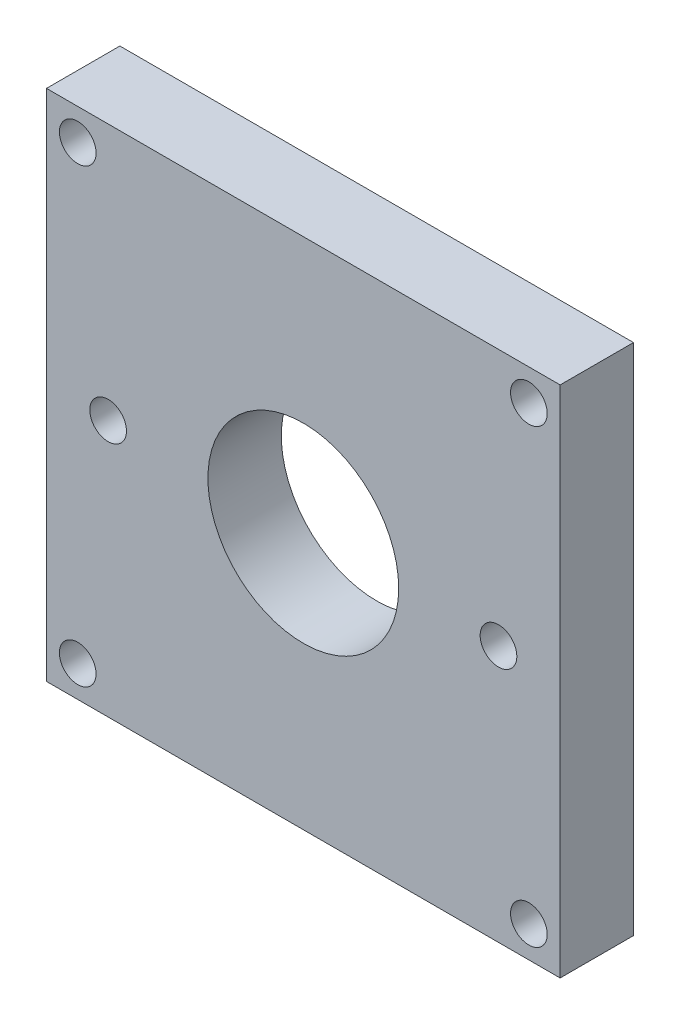
ISO-10303-21;
HEADER;
FILE_DESCRIPTION(('STEP AP214'),'2;1');
FILE_NAME('part.step','',(''),(''),'','','');
FILE_SCHEMA(('AUTOMOTIVE_DESIGN { 1 0 10303 214 1 1 1 1 }'));
ENDSEC;
DATA;
#1=APPLICATION_CONTEXT('core data for automotive mechanical design processes');
#2=APPLICATION_PROTOCOL_DEFINITION('international standard','automotive_design',2000,#1);
#3=PRODUCT_CONTEXT('',#1,'mechanical');
#4=PRODUCT('Part','Part','',(#3));
#5=PRODUCT_RELATED_PRODUCT_CATEGORY('part','',(#4));
#6=PRODUCT_DEFINITION_FORMATION('','',#4);
#7=PRODUCT_DEFINITION_CONTEXT('part definition',#1,'design');
#8=PRODUCT_DEFINITION('design','',#6,#7);
#9=PRODUCT_DEFINITION_SHAPE('','',#8);
#10=(LENGTH_UNIT() NAMED_UNIT(*) SI_UNIT(.MILLI.,.METRE.));
#11=(NAMED_UNIT(*) PLANE_ANGLE_UNIT() SI_UNIT($,.RADIAN.));
#12=(NAMED_UNIT(*) SI_UNIT($,.STERADIAN.) SOLID_ANGLE_UNIT());
#13=UNCERTAINTY_MEASURE_WITH_UNIT(LENGTH_MEASURE(1.E-05),#10,'distance_accuracy_value','');
#14=(GEOMETRIC_REPRESENTATION_CONTEXT(3) GLOBAL_UNCERTAINTY_ASSIGNED_CONTEXT((#13)) GLOBAL_UNIT_ASSIGNED_CONTEXT((#10,
#11,#12)) REPRESENTATION_CONTEXT('',''));
#15=CARTESIAN_POINT('',(0.,0.,0.));
#16=DIRECTION('',(0.,0.,1.));
#17=DIRECTION('',(1.,0.,0.));
#18=AXIS2_PLACEMENT_3D('',#15,#16,#17);
#19=CARTESIAN_POINT('',(-17.5,0.,5.));
#20=DIRECTION('',(-1.,0.,0.));
#21=DIRECTION('',(0.,0.,1.));
#22=AXIS2_PLACEMENT_3D('',#19,#20,#21);
#23=PLANE('',#22);
#24=DIRECTION('',(0.,1.,0.));
#25=VECTOR('',#24,1.);
#26=CARTESIAN_POINT('',(-17.5,0.,0.));
#27=LINE('',#26,#25);
#28=CARTESIAN_POINT('',(-17.5,-17.5,0.));
#29=VERTEX_POINT('',#28);
#30=CARTESIAN_POINT('',(-17.5,17.5,0.));
#31=VERTEX_POINT('',#30);
#32=EDGE_CURVE('E122',#29,#31,#27,.T.);
#33=ORIENTED_EDGE('',*,*,#32,.F.);
#34=DIRECTION('',(0.,0.,-1.));
#35=VECTOR('',#34,1.);
#36=CARTESIAN_POINT('',(-17.5,-17.5,5.));
#37=LINE('',#36,#35);
#38=CARTESIAN_POINT('',(-17.5,-17.5,5.));
#39=VERTEX_POINT('',#38);
#40=EDGE_CURVE('E11',#39,#29,#37,.T.);
#41=ORIENTED_EDGE('',*,*,#40,.F.);
#42=DIRECTION('',(0.,1.,0.));
#43=VECTOR('',#42,1.);
#44=CARTESIAN_POINT('',(-17.5,0.,5.));
#45=LINE('',#44,#43);
#46=CARTESIAN_POINT('',(-17.5,17.5,5.));
#47=VERTEX_POINT('',#46);
#48=EDGE_CURVE('E94',#39,#47,#45,.T.);
#49=ORIENTED_EDGE('',*,*,#48,.T.);
#50=DIRECTION('',(0.,0.,-1.));
#51=VECTOR('',#50,1.);
#52=CARTESIAN_POINT('',(-17.5,17.5,5.));
#53=LINE('',#52,#51);
#54=EDGE_CURVE('E73',#47,#31,#53,.T.);
#55=ORIENTED_EDGE('',*,*,#54,.T.);
#56=EDGE_LOOP('',(#33,#41,#49,#55));
#57=FACE_BOUND('',#56,.T.);
#58=ADVANCED_FACE('F33',(#57),#23,.T.);
#59=CARTESIAN_POINT('',(0.,-17.5,5.));
#60=DIRECTION('',(0.,-1.,0.));
#61=DIRECTION('',(0.,0.,-1.));
#62=AXIS2_PLACEMENT_3D('',#59,#60,#61);
#63=PLANE('',#62);
#64=DIRECTION('',(-1.,0.,0.));
#65=VECTOR('',#64,1.);
#66=CARTESIAN_POINT('',(0.,-17.5,0.));
#67=LINE('',#66,#65);
#68=CARTESIAN_POINT('',(17.5,-17.5,0.));
#69=VERTEX_POINT('',#68);
#70=EDGE_CURVE('E85',#69,#29,#67,.T.);
#71=ORIENTED_EDGE('',*,*,#70,.F.);
#72=DIRECTION('',(0.,0.,-1.));
#73=VECTOR('',#72,1.);
#74=CARTESIAN_POINT('',(17.5,-17.5,5.));
#75=LINE('',#74,#73);
#76=CARTESIAN_POINT('',(17.5,-17.5,5.));
#77=VERTEX_POINT('',#76);
#78=EDGE_CURVE('E42',#77,#69,#75,.T.);
#79=ORIENTED_EDGE('',*,*,#78,.F.);
#80=DIRECTION('',(-1.,0.,0.));
#81=VECTOR('',#80,1.);
#82=CARTESIAN_POINT('',(0.,-17.5,5.));
#83=LINE('',#82,#81);
#84=EDGE_CURVE('E83',#77,#39,#83,.T.);
#85=ORIENTED_EDGE('',*,*,#84,.T.);
#86=ORIENTED_EDGE('',*,*,#40,.T.);
#87=EDGE_LOOP('',(#71,#79,#85,#86));
#88=FACE_BOUND('',#87,.T.);
#89=ADVANCED_FACE('F81',(#88),#63,.T.);
#90=CARTESIAN_POINT('',(17.5,0.,5.));
#91=DIRECTION('',(-1.,0.,0.));
#92=DIRECTION('',(0.,0.,1.));
#93=AXIS2_PLACEMENT_3D('',#90,#91,#92);
#94=PLANE('',#93);
#95=DIRECTION('',(0.,1.,0.));
#96=VECTOR('',#95,1.);
#97=CARTESIAN_POINT('',(17.5,0.,0.));
#98=LINE('',#97,#96);
#99=CARTESIAN_POINT('',(17.5,17.5,0.));
#100=VERTEX_POINT('',#99);
#101=EDGE_CURVE('E125',#69,#100,#98,.T.);
#102=ORIENTED_EDGE('',*,*,#101,.T.);
#103=DIRECTION('',(0.,0.,-1.));
#104=VECTOR('',#103,1.);
#105=CARTESIAN_POINT('',(17.5,17.5,5.));
#106=LINE('',#105,#104);
#107=CARTESIAN_POINT('',(17.5,17.5,5.));
#108=VERTEX_POINT('',#107);
#109=EDGE_CURVE('E88',#108,#100,#106,.T.);
#110=ORIENTED_EDGE('',*,*,#109,.F.);
#111=DIRECTION('',(0.,1.,0.));
#112=VECTOR('',#111,1.);
#113=CARTESIAN_POINT('',(17.5,0.,5.));
#114=LINE('',#113,#112);
#115=EDGE_CURVE('E90',#77,#108,#114,.T.);
#116=ORIENTED_EDGE('',*,*,#115,.F.);
#117=ORIENTED_EDGE('',*,*,#78,.T.);
#118=EDGE_LOOP('',(#102,#110,#116,#117));
#119=FACE_BOUND('',#118,.T.);
#120=ADVANCED_FACE('F91',(#119),#94,.F.);
#121=CARTESIAN_POINT('',(-15.37,15.37,5.));
#122=DIRECTION('',(0.,0.,-1.));
#123=DIRECTION('',(-1.,0.,0.));
#124=AXIS2_PLACEMENT_3D('',#121,#122,#123);
#125=CYLINDRICAL_SURFACE('',#124,1.25);
#126=CARTESIAN_POINT('',(-15.37,15.37,5.));
#127=DIRECTION('',(0.,0.,1.));
#128=DIRECTION('',(1.,0.,0.));
#129=AXIS2_PLACEMENT_3D('',#126,#127,#128);
#130=CIRCLE('',#129,1.25);
#131=CARTESIAN_POINT('',(-14.12,15.37,5.));
#132=VERTEX_POINT('',#131);
#133=EDGE_CURVE('E96',#132,#132,#130,.T.);
#134=ORIENTED_EDGE('',*,*,#133,.T.);
#135=EDGE_LOOP('',(#134));
#136=FACE_BOUND('',#135,.T.);
#137=CARTESIAN_POINT('',(-15.37,15.37,0.));
#138=DIRECTION('',(0.,0.,1.));
#139=DIRECTION('',(1.,0.,0.));
#140=AXIS2_PLACEMENT_3D('',#137,#138,#139);
#141=CIRCLE('',#140,1.25);
#142=CARTESIAN_POINT('',(-14.12,15.37,0.));
#143=VERTEX_POINT('',#142);
#144=EDGE_CURVE('E119',#143,#143,#141,.T.);
#145=ORIENTED_EDGE('',*,*,#144,.F.);
#146=EDGE_LOOP('',(#145));
#147=FACE_BOUND('',#146,.T.);
#148=ADVANCED_FACE('F141',(#136,#147),#125,.F.);
#149=CARTESIAN_POINT('',(15.37,15.37,5.));
#150=DIRECTION('',(0.,0.,-1.));
#151=DIRECTION('',(-1.,0.,0.));
#152=AXIS2_PLACEMENT_3D('',#149,#150,#151);
#153=CYLINDRICAL_SURFACE('',#152,1.25);
#154=CARTESIAN_POINT('',(15.37,15.37,5.));
#155=DIRECTION('',(0.,0.,1.));
#156=DIRECTION('',(1.,0.,0.));
#157=AXIS2_PLACEMENT_3D('',#154,#155,#156);
#158=CIRCLE('',#157,1.25);
#159=CARTESIAN_POINT('',(16.62,15.37,5.));
#160=VERTEX_POINT('',#159);
#161=EDGE_CURVE('E292',#160,#160,#158,.T.);
#162=ORIENTED_EDGE('',*,*,#161,.T.);
#163=EDGE_LOOP('',(#162));
#164=FACE_BOUND('',#163,.T.);
#165=CARTESIAN_POINT('',(15.37,15.37,0.));
#166=DIRECTION('',(0.,0.,1.));
#167=DIRECTION('',(1.,0.,0.));
#168=AXIS2_PLACEMENT_3D('',#165,#166,#167);
#169=CIRCLE('',#168,1.25);
#170=CARTESIAN_POINT('',(16.62,15.37,0.));
#171=VERTEX_POINT('',#170);
#172=EDGE_CURVE('E116',#171,#171,#169,.T.);
#173=ORIENTED_EDGE('',*,*,#172,.F.);
#174=EDGE_LOOP('',(#173));
#175=FACE_BOUND('',#174,.T.);
#176=ADVANCED_FACE('F144',(#164,#175),#153,.F.);
#177=CARTESIAN_POINT('',(15.37,-15.37,5.));
#178=DIRECTION('',(0.,0.,-1.));
#179=DIRECTION('',(-1.,0.,0.));
#180=AXIS2_PLACEMENT_3D('',#177,#178,#179);
#181=CYLINDRICAL_SURFACE('',#180,1.25);
#182=CARTESIAN_POINT('',(15.37,-15.37,5.));
#183=DIRECTION('',(0.,0.,1.));
#184=DIRECTION('',(1.,0.,0.));
#185=AXIS2_PLACEMENT_3D('',#182,#183,#184);
#186=CIRCLE('',#185,1.25);
#187=CARTESIAN_POINT('',(16.62,-15.37,5.));
#188=VERTEX_POINT('',#187);
#189=EDGE_CURVE('E288',#188,#188,#186,.T.);
#190=ORIENTED_EDGE('',*,*,#189,.T.);
#191=EDGE_LOOP('',(#190));
#192=FACE_BOUND('',#191,.T.);
#193=CARTESIAN_POINT('',(15.37,-15.37,0.));
#194=DIRECTION('',(0.,0.,1.));
#195=DIRECTION('',(1.,0.,0.));
#196=AXIS2_PLACEMENT_3D('',#193,#194,#195);
#197=CIRCLE('',#196,1.25);
#198=CARTESIAN_POINT('',(16.62,-15.37,0.));
#199=VERTEX_POINT('',#198);
#200=EDGE_CURVE('E113',#199,#199,#197,.T.);
#201=ORIENTED_EDGE('',*,*,#200,.F.);
#202=EDGE_LOOP('',(#201));
#203=FACE_BOUND('',#202,.T.);
#204=ADVANCED_FACE('F148',(#192,#203),#181,.F.);
#205=CARTESIAN_POINT('',(-15.37,-15.37,5.));
#206=DIRECTION('',(0.,0.,-1.));
#207=DIRECTION('',(-1.,0.,0.));
#208=AXIS2_PLACEMENT_3D('',#205,#206,#207);
#209=CYLINDRICAL_SURFACE('',#208,1.25);
#210=CARTESIAN_POINT('',(-15.37,-15.37,5.));
#211=DIRECTION('',(0.,0.,1.));
#212=DIRECTION('',(1.,0.,0.));
#213=AXIS2_PLACEMENT_3D('',#210,#211,#212);
#214=CIRCLE('',#213,1.25);
#215=CARTESIAN_POINT('',(-14.12,-15.37,5.));
#216=VERTEX_POINT('',#215);
#217=EDGE_CURVE('E284',#216,#216,#214,.T.);
#218=ORIENTED_EDGE('',*,*,#217,.T.);
#219=EDGE_LOOP('',(#218));
#220=FACE_BOUND('',#219,.T.);
#221=CARTESIAN_POINT('',(-15.37,-15.37,0.));
#222=DIRECTION('',(0.,0.,1.));
#223=DIRECTION('',(1.,0.,0.));
#224=AXIS2_PLACEMENT_3D('',#221,#222,#223);
#225=CIRCLE('',#224,1.25);
#226=CARTESIAN_POINT('',(-14.12,-15.37,0.));
#227=VERTEX_POINT('',#226);
#228=EDGE_CURVE('E110',#227,#227,#225,.T.);
#229=ORIENTED_EDGE('',*,*,#228,.F.);
#230=EDGE_LOOP('',(#229));
#231=FACE_BOUND('',#230,.T.);
#232=ADVANCED_FACE('F152',(#220,#231),#209,.F.);
#233=CARTESIAN_POINT('',(-13.3,0.,5.));
#234=DIRECTION('',(0.,0.,-1.));
#235=DIRECTION('',(-1.,0.,0.));
#236=AXIS2_PLACEMENT_3D('',#233,#234,#235);
#237=CYLINDRICAL_SURFACE('',#236,1.25);
#238=CARTESIAN_POINT('',(-13.3,0.,5.));
#239=DIRECTION('',(0.,0.,1.));
#240=DIRECTION('',(1.,0.,0.));
#241=AXIS2_PLACEMENT_3D('',#238,#239,#240);
#242=CIRCLE('',#241,1.25);
#243=CARTESIAN_POINT('',(-12.05,0.,5.));
#244=VERTEX_POINT('',#243);
#245=EDGE_CURVE('E280',#244,#244,#242,.T.);
#246=ORIENTED_EDGE('',*,*,#245,.T.);
#247=EDGE_LOOP('',(#246));
#248=FACE_BOUND('',#247,.T.);
#249=CARTESIAN_POINT('',(-13.3,0.,0.));
#250=DIRECTION('',(0.,0.,1.));
#251=DIRECTION('',(1.,0.,0.));
#252=AXIS2_PLACEMENT_3D('',#249,#250,#251);
#253=CIRCLE('',#252,1.25);
#254=CARTESIAN_POINT('',(-12.05,0.,0.));
#255=VERTEX_POINT('',#254);
#256=EDGE_CURVE('E107',#255,#255,#253,.T.);
#257=ORIENTED_EDGE('',*,*,#256,.F.);
#258=EDGE_LOOP('',(#257));
#259=FACE_BOUND('',#258,.T.);
#260=ADVANCED_FACE('F156',(#248,#259),#237,.F.);
#261=CARTESIAN_POINT('',(13.3,0.,5.));
#262=DIRECTION('',(0.,0.,-1.));
#263=DIRECTION('',(-1.,0.,0.));
#264=AXIS2_PLACEMENT_3D('',#261,#262,#263);
#265=CYLINDRICAL_SURFACE('',#264,1.25);
#266=CARTESIAN_POINT('',(13.3,0.,5.));
#267=DIRECTION('',(0.,0.,1.));
#268=DIRECTION('',(1.,0.,0.));
#269=AXIS2_PLACEMENT_3D('',#266,#267,#268);
#270=CIRCLE('',#269,1.25);
#271=CARTESIAN_POINT('',(14.55,0.,5.));
#272=VERTEX_POINT('',#271);
#273=EDGE_CURVE('E170',#272,#272,#270,.T.);
#274=ORIENTED_EDGE('',*,*,#273,.T.);
#275=EDGE_LOOP('',(#274));
#276=FACE_BOUND('',#275,.T.);
#277=CARTESIAN_POINT('',(13.3,0.,0.));
#278=DIRECTION('',(0.,0.,1.));
#279=DIRECTION('',(1.,0.,0.));
#280=AXIS2_PLACEMENT_3D('',#277,#278,#279);
#281=CIRCLE('',#280,1.25);
#282=CARTESIAN_POINT('',(14.55,0.,0.));
#283=VERTEX_POINT('',#282);
#284=EDGE_CURVE('E104',#283,#283,#281,.T.);
#285=ORIENTED_EDGE('',*,*,#284,.F.);
#286=EDGE_LOOP('',(#285));
#287=FACE_BOUND('',#286,.T.);
#288=ADVANCED_FACE('F159',(#276,#287),#265,.F.);
#289=CARTESIAN_POINT('',(0.,0.,5.));
#290=DIRECTION('',(0.,0.,-1.));
#291=DIRECTION('',(-1.,0.,0.));
#292=AXIS2_PLACEMENT_3D('',#289,#290,#291);
#293=CYLINDRICAL_SURFACE('',#292,6.5);
#294=CARTESIAN_POINT('',(0.,0.,5.));
#295=DIRECTION('',(0.,0.,1.));
#296=DIRECTION('',(1.,0.,0.));
#297=AXIS2_PLACEMENT_3D('',#294,#295,#296);
#298=CIRCLE('',#297,6.5);
#299=CARTESIAN_POINT('',(6.5,0.,5.));
#300=VERTEX_POINT('',#299);
#301=EDGE_CURVE('E128',#300,#300,#298,.T.);
#302=ORIENTED_EDGE('',*,*,#301,.T.);
#303=EDGE_LOOP('',(#302));
#304=FACE_BOUND('',#303,.T.);
#305=CARTESIAN_POINT('',(0.,0.,0.));
#306=DIRECTION('',(0.,0.,1.));
#307=DIRECTION('',(1.,0.,0.));
#308=AXIS2_PLACEMENT_3D('',#305,#306,#307);
#309=CIRCLE('',#308,6.5);
#310=CARTESIAN_POINT('',(6.5,0.,0.));
#311=VERTEX_POINT('',#310);
#312=EDGE_CURVE('E101',#311,#311,#309,.T.);
#313=ORIENTED_EDGE('',*,*,#312,.F.);
#314=EDGE_LOOP('',(#313));
#315=FACE_BOUND('',#314,.T.);
#316=ADVANCED_FACE('F35',(#304,#315),#293,.F.);
#317=CARTESIAN_POINT('',(0.,17.5,5.));
#318=DIRECTION('',(0.,-1.,0.));
#319=DIRECTION('',(0.,0.,-1.));
#320=AXIS2_PLACEMENT_3D('',#317,#318,#319);
#321=PLANE('',#320);
#322=DIRECTION('',(-1.,0.,0.));
#323=VECTOR('',#322,1.);
#324=CARTESIAN_POINT('',(0.,17.5,0.));
#325=LINE('',#324,#323);
#326=EDGE_CURVE('E66',#100,#31,#325,.T.);
#327=ORIENTED_EDGE('',*,*,#326,.T.);
#328=ORIENTED_EDGE('',*,*,#54,.F.);
#329=DIRECTION('',(-1.,0.,0.));
#330=VECTOR('',#329,1.);
#331=CARTESIAN_POINT('',(0.,17.5,5.));
#332=LINE('',#331,#330);
#333=EDGE_CURVE('E50',#108,#47,#332,.T.);
#334=ORIENTED_EDGE('',*,*,#333,.F.);
#335=ORIENTED_EDGE('',*,*,#109,.T.);
#336=EDGE_LOOP('',(#327,#328,#334,#335));
#337=FACE_BOUND('',#336,.T.);
#338=ADVANCED_FACE('F131',(#337),#321,.F.);
#339=CARTESIAN_POINT('',(0.,0.,5.));
#340=DIRECTION('',(0.,0.,1.));
#341=DIRECTION('',(1.,0.,0.));
#342=AXIS2_PLACEMENT_3D('',#339,#340,#341);
#343=PLANE('',#342);
#344=ORIENTED_EDGE('',*,*,#301,.F.);
#345=EDGE_LOOP('',(#344));
#346=FACE_BOUND('',#345,.T.);
#347=ORIENTED_EDGE('',*,*,#273,.F.);
#348=EDGE_LOOP('',(#347));
#349=FACE_BOUND('',#348,.T.);
#350=ORIENTED_EDGE('',*,*,#245,.F.);
#351=EDGE_LOOP('',(#350));
#352=FACE_BOUND('',#351,.T.);
#353=ORIENTED_EDGE('',*,*,#217,.F.);
#354=EDGE_LOOP('',(#353));
#355=FACE_BOUND('',#354,.T.);
#356=ORIENTED_EDGE('',*,*,#189,.F.);
#357=EDGE_LOOP('',(#356));
#358=FACE_BOUND('',#357,.T.);
#359=ORIENTED_EDGE('',*,*,#161,.F.);
#360=EDGE_LOOP('',(#359));
#361=FACE_BOUND('',#360,.T.);
#362=ORIENTED_EDGE('',*,*,#133,.F.);
#363=EDGE_LOOP('',(#362));
#364=FACE_BOUND('',#363,.T.);
#365=ORIENTED_EDGE('',*,*,#48,.F.);
#366=ORIENTED_EDGE('',*,*,#84,.F.);
#367=ORIENTED_EDGE('',*,*,#115,.T.);
#368=ORIENTED_EDGE('',*,*,#333,.T.);
#369=EDGE_LOOP('',(#365,#366,#367,#368));
#370=FACE_BOUND('',#369,.T.);
#371=ADVANCED_FACE('F93',(#346,#349,#352,#355,#358,#361,#364,#370),#343,.T.);
#372=CARTESIAN_POINT('',(0.,0.,0.));
#373=DIRECTION('',(0.,0.,1.));
#374=DIRECTION('',(1.,0.,0.));
#375=AXIS2_PLACEMENT_3D('',#372,#373,#374);
#376=PLANE('',#375);
#377=ORIENTED_EDGE('',*,*,#312,.T.);
#378=EDGE_LOOP('',(#377));
#379=FACE_BOUND('',#378,.T.);
#380=ORIENTED_EDGE('',*,*,#284,.T.);
#381=EDGE_LOOP('',(#380));
#382=FACE_BOUND('',#381,.T.);
#383=ORIENTED_EDGE('',*,*,#256,.T.);
#384=EDGE_LOOP('',(#383));
#385=FACE_BOUND('',#384,.T.);
#386=ORIENTED_EDGE('',*,*,#228,.T.);
#387=EDGE_LOOP('',(#386));
#388=FACE_BOUND('',#387,.T.);
#389=ORIENTED_EDGE('',*,*,#200,.T.);
#390=EDGE_LOOP('',(#389));
#391=FACE_BOUND('',#390,.T.);
#392=ORIENTED_EDGE('',*,*,#172,.T.);
#393=EDGE_LOOP('',(#392));
#394=FACE_BOUND('',#393,.T.);
#395=ORIENTED_EDGE('',*,*,#144,.T.);
#396=EDGE_LOOP('',(#395));
#397=FACE_BOUND('',#396,.T.);
#398=ORIENTED_EDGE('',*,*,#32,.T.);
#399=ORIENTED_EDGE('',*,*,#326,.F.);
#400=ORIENTED_EDGE('',*,*,#101,.F.);
#401=ORIENTED_EDGE('',*,*,#70,.T.);
#402=EDGE_LOOP('',(#398,#399,#400,#401));
#403=FACE_BOUND('',#402,.T.);
#404=ADVANCED_FACE('F132',(#379,#382,#385,#388,#391,#394,#397,#403),#376,.F.);
#405=CLOSED_SHELL('',(#58,#89,#120,#148,#176,#204,#232,#260,#288,#316,#338,#371,#404));
#406=MANIFOLD_SOLID_BREP('B2',#405);
#407=ADVANCED_BREP_SHAPE_REPRESENTATION('',(#18,#406),#14);
#408=SHAPE_DEFINITION_REPRESENTATION(#9,#407);
ENDSEC;
END-ISO-10303-21;
